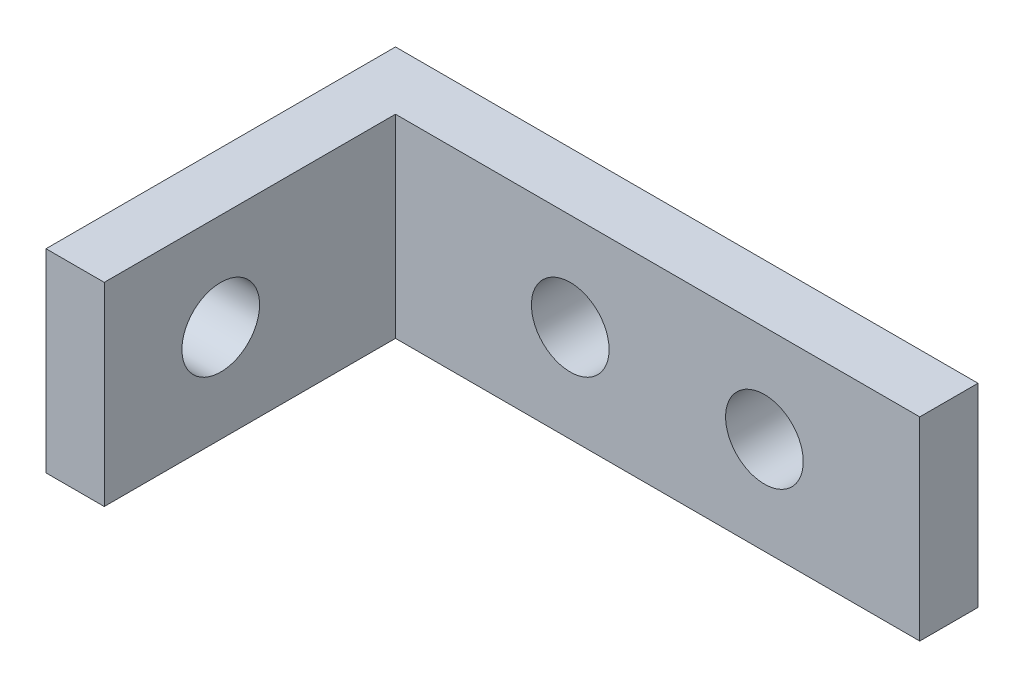
ISO-10303-21;
HEADER;
FILE_DESCRIPTION(('STEP AP214'),'2;1');
FILE_NAME('part.step','',(''),(''),'','','');
FILE_SCHEMA(('AUTOMOTIVE_DESIGN { 1 0 10303 214 1 1 1 1 }'));
ENDSEC;
DATA;
#1=APPLICATION_CONTEXT('core data for automotive mechanical design processes');
#2=APPLICATION_PROTOCOL_DEFINITION('international standard','automotive_design',2000,#1);
#3=PRODUCT_CONTEXT('',#1,'mechanical');
#4=PRODUCT('Part','Part','',(#3));
#5=PRODUCT_RELATED_PRODUCT_CATEGORY('part','',(#4));
#6=PRODUCT_DEFINITION_FORMATION('','',#4);
#7=PRODUCT_DEFINITION_CONTEXT('part definition',#1,'design');
#8=PRODUCT_DEFINITION('design','',#6,#7);
#9=PRODUCT_DEFINITION_SHAPE('','',#8);
#10=(LENGTH_UNIT() NAMED_UNIT(*) SI_UNIT(.MILLI.,.METRE.));
#11=(NAMED_UNIT(*) PLANE_ANGLE_UNIT() SI_UNIT($,.RADIAN.));
#12=(NAMED_UNIT(*) SI_UNIT($,.STERADIAN.) SOLID_ANGLE_UNIT());
#13=UNCERTAINTY_MEASURE_WITH_UNIT(LENGTH_MEASURE(1.E-05),#10,'distance_accuracy_value','');
#14=(GEOMETRIC_REPRESENTATION_CONTEXT(3) GLOBAL_UNCERTAINTY_ASSIGNED_CONTEXT((#13)) GLOBAL_UNIT_ASSIGNED_CONTEXT((#10,
#11,#12)) REPRESENTATION_CONTEXT('',''));
#15=CARTESIAN_POINT('',(0.,0.,0.));
#16=DIRECTION('',(0.,0.,1.));
#17=DIRECTION('',(1.,0.,0.));
#18=AXIS2_PLACEMENT_3D('',#15,#16,#17);
#19=CARTESIAN_POINT('',(0.,0.,3.));
#20=DIRECTION('',(0.,0.,-1.));
#21=DIRECTION('',(-1.,0.,0.));
#22=AXIS2_PLACEMENT_3D('',#19,#20,#21);
#23=PLANE('',#22);
#24=CARTESIAN_POINT('',(22.,5.,3.));
#25=DIRECTION('',(0.,0.,1.));
#26=DIRECTION('',(1.,0.,0.));
#27=AXIS2_PLACEMENT_3D('',#24,#25,#26);
#28=CIRCLE('',#27,2.);
#29=CARTESIAN_POINT('',(24.,5.,3.));
#30=VERTEX_POINT('',#29);
#31=EDGE_CURVE('E150',#30,#30,#28,.T.);
#32=ORIENTED_EDGE('',*,*,#31,.F.);
#33=EDGE_LOOP('',(#32));
#34=FACE_BOUND('',#33,.T.);
#35=CARTESIAN_POINT('',(12.,5.,3.));
#36=DIRECTION('',(0.,0.,1.));
#37=DIRECTION('',(1.,0.,0.));
#38=AXIS2_PLACEMENT_3D('',#35,#36,#37);
#39=CIRCLE('',#38,2.);
#40=CARTESIAN_POINT('',(14.,5.,3.));
#41=VERTEX_POINT('',#40);
#42=EDGE_CURVE('E100',#41,#41,#39,.T.);
#43=ORIENTED_EDGE('',*,*,#42,.F.);
#44=EDGE_LOOP('',(#43));
#45=FACE_BOUND('',#44,.T.);
#46=DIRECTION('',(0.,1.,0.));
#47=VECTOR('',#46,1.);
#48=CARTESIAN_POINT('',(3.,10.,3.));
#49=LINE('',#48,#47);
#50=CARTESIAN_POINT('',(3.,0.,3.));
#51=VERTEX_POINT('',#50);
#52=CARTESIAN_POINT('',(3.,10.,3.));
#53=VERTEX_POINT('',#52);
#54=EDGE_CURVE('E48',#51,#53,#49,.T.);
#55=ORIENTED_EDGE('',*,*,#54,.F.);
#56=DIRECTION('',(1.,0.,0.));
#57=VECTOR('',#56,1.);
#58=CARTESIAN_POINT('',(0.,0.,3.));
#59=LINE('',#58,#57);
#60=CARTESIAN_POINT('',(30.,0.,3.));
#61=VERTEX_POINT('',#60);
#62=EDGE_CURVE('E85',#51,#61,#59,.T.);
#63=ORIENTED_EDGE('',*,*,#62,.T.);
#64=DIRECTION('',(0.,1.,0.));
#65=VECTOR('',#64,1.);
#66=CARTESIAN_POINT('',(30.,0.,3.));
#67=LINE('',#66,#65);
#68=CARTESIAN_POINT('',(30.,10.,3.));
#69=VERTEX_POINT('',#68);
#70=EDGE_CURVE('E54',#61,#69,#67,.T.);
#71=ORIENTED_EDGE('',*,*,#70,.T.);
#72=DIRECTION('',(-1.,0.,0.));
#73=VECTOR('',#72,1.);
#74=CARTESIAN_POINT('',(0.,10.,3.));
#75=LINE('',#74,#73);
#76=EDGE_CURVE('E95',#69,#53,#75,.T.);
#77=ORIENTED_EDGE('',*,*,#76,.T.);
#78=EDGE_LOOP('',(#55,#63,#71,#77));
#79=FACE_BOUND('',#78,.T.);
#80=ADVANCED_FACE('F33',(#34,#45,#79),#23,.F.);
#81=CARTESIAN_POINT('',(0.,0.,0.));
#82=DIRECTION('',(0.,0.,-1.));
#83=DIRECTION('',(-1.,0.,0.));
#84=AXIS2_PLACEMENT_3D('',#81,#82,#83);
#85=PLANE('',#84);
#86=CARTESIAN_POINT('',(12.,5.,0.));
#87=DIRECTION('',(0.,0.,1.));
#88=DIRECTION('',(1.,0.,0.));
#89=AXIS2_PLACEMENT_3D('',#86,#87,#88);
#90=CIRCLE('',#89,2.);
#91=CARTESIAN_POINT('',(14.,5.,0.));
#92=VERTEX_POINT('',#91);
#93=EDGE_CURVE('E104',#92,#92,#90,.T.);
#94=ORIENTED_EDGE('',*,*,#93,.T.);
#95=EDGE_LOOP('',(#94));
#96=FACE_BOUND('',#95,.T.);
#97=DIRECTION('',(0.,-1.,0.));
#98=VECTOR('',#97,1.);
#99=CARTESIAN_POINT('',(0.,0.,0.));
#100=LINE('',#99,#98);
#101=CARTESIAN_POINT('',(0.,10.,0.));
#102=VERTEX_POINT('',#101);
#103=CARTESIAN_POINT('',(0.,0.,0.));
#104=VERTEX_POINT('',#103);
#105=EDGE_CURVE('E92',#102,#104,#100,.T.);
#106=ORIENTED_EDGE('',*,*,#105,.F.);
#107=DIRECTION('',(-1.,0.,0.));
#108=VECTOR('',#107,1.);
#109=CARTESIAN_POINT('',(0.,10.,0.));
#110=LINE('',#109,#108);
#111=CARTESIAN_POINT('',(30.,10.,0.));
#112=VERTEX_POINT('',#111);
#113=EDGE_CURVE('E74',#112,#102,#110,.T.);
#114=ORIENTED_EDGE('',*,*,#113,.F.);
#115=DIRECTION('',(0.,1.,0.));
#116=VECTOR('',#115,1.);
#117=CARTESIAN_POINT('',(30.,0.,0.));
#118=LINE('',#117,#116);
#119=CARTESIAN_POINT('',(30.,0.,0.));
#120=VERTEX_POINT('',#119);
#121=EDGE_CURVE('E86',#120,#112,#118,.T.);
#122=ORIENTED_EDGE('',*,*,#121,.F.);
#123=DIRECTION('',(1.,0.,0.));
#124=VECTOR('',#123,1.);
#125=CARTESIAN_POINT('',(0.,0.,0.));
#126=LINE('',#125,#124);
#127=EDGE_CURVE('E99',#104,#120,#126,.T.);
#128=ORIENTED_EDGE('',*,*,#127,.F.);
#129=EDGE_LOOP('',(#106,#114,#122,#128));
#130=FACE_BOUND('',#129,.T.);
#131=CARTESIAN_POINT('',(22.,5.,0.));
#132=DIRECTION('',(0.,0.,1.));
#133=DIRECTION('',(1.,0.,0.));
#134=AXIS2_PLACEMENT_3D('',#131,#132,#133);
#135=CIRCLE('',#134,2.);
#136=CARTESIAN_POINT('',(24.,5.,0.));
#137=VERTEX_POINT('',#136);
#138=EDGE_CURVE('E149',#137,#137,#135,.T.);
#139=ORIENTED_EDGE('',*,*,#138,.T.);
#140=EDGE_LOOP('',(#139));
#141=FACE_BOUND('',#140,.T.);
#142=ADVANCED_FACE('F97',(#96,#130,#141),#85,.T.);
#143=CARTESIAN_POINT('',(0.,0.,3.));
#144=DIRECTION('',(1.,0.,0.));
#145=DIRECTION('',(0.,0.,-1.));
#146=AXIS2_PLACEMENT_3D('',#143,#144,#145);
#147=PLANE('',#146);
#148=CARTESIAN_POINT('',(0.,5.,12.));
#149=DIRECTION('',(1.,0.,0.));
#150=DIRECTION('',(0.,0.,-1.));
#151=AXIS2_PLACEMENT_3D('',#148,#149,#150);
#152=CIRCLE('',#151,2.);
#153=CARTESIAN_POINT('',(0.,5.,10.));
#154=VERTEX_POINT('',#153);
#155=EDGE_CURVE('E146',#154,#154,#152,.T.);
#156=ORIENTED_EDGE('',*,*,#155,.T.);
#157=EDGE_LOOP('',(#156));
#158=FACE_BOUND('',#157,.T.);
#159=ORIENTED_EDGE('',*,*,#105,.T.);
#160=DIRECTION('',(0.,0.,-1.));
#161=VECTOR('',#160,1.);
#162=CARTESIAN_POINT('',(0.,0.,3.));
#163=LINE('',#162,#161);
#164=CARTESIAN_POINT('',(0.,0.,18.));
#165=VERTEX_POINT('',#164);
#166=EDGE_CURVE('E11',#165,#104,#163,.T.);
#167=ORIENTED_EDGE('',*,*,#166,.F.);
#168=DIRECTION('',(0.,-1.,0.));
#169=VECTOR('',#168,1.);
#170=CARTESIAN_POINT('',(0.,10.,18.));
#171=LINE('',#170,#169);
#172=CARTESIAN_POINT('',(0.,10.,18.));
#173=VERTEX_POINT('',#172);
#174=EDGE_CURVE('E94',#173,#165,#171,.T.);
#175=ORIENTED_EDGE('',*,*,#174,.F.);
#176=DIRECTION('',(0.,0.,-1.));
#177=VECTOR('',#176,1.);
#178=CARTESIAN_POINT('',(0.,10.,3.));
#179=LINE('',#178,#177);
#180=EDGE_CURVE('E78',#173,#102,#179,.T.);
#181=ORIENTED_EDGE('',*,*,#180,.T.);
#182=EDGE_LOOP('',(#159,#167,#175,#181));
#183=FACE_BOUND('',#182,.T.);
#184=ADVANCED_FACE('F35',(#158,#183),#147,.F.);
#185=CARTESIAN_POINT('',(0.,0.,3.));
#186=DIRECTION('',(0.,1.,0.));
#187=DIRECTION('',(0.,0.,1.));
#188=AXIS2_PLACEMENT_3D('',#185,#186,#187);
#189=PLANE('',#188);
#190=ORIENTED_EDGE('',*,*,#127,.T.);
#191=DIRECTION('',(0.,0.,-1.));
#192=VECTOR('',#191,1.);
#193=CARTESIAN_POINT('',(30.,0.,3.));
#194=LINE('',#193,#192);
#195=EDGE_CURVE('E41',#61,#120,#194,.T.);
#196=ORIENTED_EDGE('',*,*,#195,.F.);
#197=ORIENTED_EDGE('',*,*,#62,.F.);
#198=DIRECTION('',(0.,0.,-1.));
#199=VECTOR('',#198,1.);
#200=CARTESIAN_POINT('',(3.,0.,18.));
#201=LINE('',#200,#199);
#202=CARTESIAN_POINT('',(3.,0.,18.));
#203=VERTEX_POINT('',#202);
#204=EDGE_CURVE('E141',#203,#51,#201,.T.);
#205=ORIENTED_EDGE('',*,*,#204,.F.);
#206=DIRECTION('',(1.,0.,0.));
#207=VECTOR('',#206,1.);
#208=CARTESIAN_POINT('',(0.,0.,18.));
#209=LINE('',#208,#207);
#210=EDGE_CURVE('E121',#165,#203,#209,.T.);
#211=ORIENTED_EDGE('',*,*,#210,.F.);
#212=ORIENTED_EDGE('',*,*,#166,.T.);
#213=EDGE_LOOP('',(#190,#196,#197,#205,#211,#212));
#214=FACE_BOUND('',#213,.T.);
#215=ADVANCED_FACE('F115',(#214),#189,.F.);
#216=CARTESIAN_POINT('',(30.,0.,3.));
#217=DIRECTION('',(-1.,0.,0.));
#218=DIRECTION('',(0.,0.,1.));
#219=AXIS2_PLACEMENT_3D('',#216,#217,#218);
#220=PLANE('',#219);
#221=ORIENTED_EDGE('',*,*,#121,.T.);
#222=DIRECTION('',(0.,0.,-1.));
#223=VECTOR('',#222,1.);
#224=CARTESIAN_POINT('',(30.,10.,3.));
#225=LINE('',#224,#223);
#226=EDGE_CURVE('E81',#69,#112,#225,.T.);
#227=ORIENTED_EDGE('',*,*,#226,.F.);
#228=ORIENTED_EDGE('',*,*,#70,.F.);
#229=ORIENTED_EDGE('',*,*,#195,.T.);
#230=EDGE_LOOP('',(#221,#227,#228,#229));
#231=FACE_BOUND('',#230,.T.);
#232=ADVANCED_FACE('F113',(#231),#220,.F.);
#233=CARTESIAN_POINT('',(0.,10.,3.));
#234=DIRECTION('',(0.,-1.,0.));
#235=DIRECTION('',(0.,0.,-1.));
#236=AXIS2_PLACEMENT_3D('',#233,#234,#235);
#237=PLANE('',#236);
#238=ORIENTED_EDGE('',*,*,#113,.T.);
#239=ORIENTED_EDGE('',*,*,#180,.F.);
#240=DIRECTION('',(-1.,0.,0.));
#241=VECTOR('',#240,1.);
#242=CARTESIAN_POINT('',(0.,10.,18.));
#243=LINE('',#242,#241);
#244=CARTESIAN_POINT('',(3.,10.,18.));
#245=VERTEX_POINT('',#244);
#246=EDGE_CURVE('E135',#245,#173,#243,.T.);
#247=ORIENTED_EDGE('',*,*,#246,.F.);
#248=DIRECTION('',(0.,0.,-1.));
#249=VECTOR('',#248,1.);
#250=CARTESIAN_POINT('',(3.,10.,18.));
#251=LINE('',#250,#249);
#252=EDGE_CURVE('E139',#245,#53,#251,.T.);
#253=ORIENTED_EDGE('',*,*,#252,.T.);
#254=ORIENTED_EDGE('',*,*,#76,.F.);
#255=ORIENTED_EDGE('',*,*,#226,.T.);
#256=EDGE_LOOP('',(#238,#239,#247,#253,#254,#255));
#257=FACE_BOUND('',#256,.T.);
#258=ADVANCED_FACE('F76',(#257),#237,.F.);
#259=CARTESIAN_POINT('',(12.,5.,3.));
#260=DIRECTION('',(0.,0.,-1.));
#261=DIRECTION('',(-1.,0.,0.));
#262=AXIS2_PLACEMENT_3D('',#259,#260,#261);
#263=CYLINDRICAL_SURFACE('',#262,2.);
#264=ORIENTED_EDGE('',*,*,#42,.T.);
#265=EDGE_LOOP('',(#264));
#266=FACE_BOUND('',#265,.T.);
#267=ORIENTED_EDGE('',*,*,#93,.F.);
#268=EDGE_LOOP('',(#267));
#269=FACE_BOUND('',#268,.T.);
#270=ADVANCED_FACE('F168',(#266,#269),#263,.F.);
#271=CARTESIAN_POINT('',(22.,5.,3.));
#272=DIRECTION('',(0.,0.,-1.));
#273=DIRECTION('',(-1.,0.,0.));
#274=AXIS2_PLACEMENT_3D('',#271,#272,#273);
#275=CYLINDRICAL_SURFACE('',#274,2.);
#276=ORIENTED_EDGE('',*,*,#31,.T.);
#277=EDGE_LOOP('',(#276));
#278=FACE_BOUND('',#277,.T.);
#279=ORIENTED_EDGE('',*,*,#138,.F.);
#280=EDGE_LOOP('',(#279));
#281=FACE_BOUND('',#280,.T.);
#282=ADVANCED_FACE('F194',(#278,#281),#275,.F.);
#283=CARTESIAN_POINT('',(3.,10.,18.));
#284=DIRECTION('',(-1.,0.,0.));
#285=DIRECTION('',(0.,-1.,0.));
#286=AXIS2_PLACEMENT_3D('',#283,#284,#285);
#287=PLANE('',#286);
#288=CARTESIAN_POINT('',(3.,5.,12.));
#289=DIRECTION('',(1.,0.,0.));
#290=DIRECTION('',(0.,1.,0.));
#291=AXIS2_PLACEMENT_3D('',#288,#289,#290);
#292=CIRCLE('',#291,2.);
#293=CARTESIAN_POINT('',(3.,7.,12.));
#294=VERTEX_POINT('',#293);
#295=EDGE_CURVE('E184',#294,#294,#292,.T.);
#296=ORIENTED_EDGE('',*,*,#295,.F.);
#297=EDGE_LOOP('',(#296));
#298=FACE_BOUND('',#297,.T.);
#299=ORIENTED_EDGE('',*,*,#54,.T.);
#300=ORIENTED_EDGE('',*,*,#252,.F.);
#301=DIRECTION('',(0.,1.,0.));
#302=VECTOR('',#301,1.);
#303=CARTESIAN_POINT('',(3.,10.,18.));
#304=LINE('',#303,#302);
#305=EDGE_CURVE('E132',#203,#245,#304,.T.);
#306=ORIENTED_EDGE('',*,*,#305,.F.);
#307=ORIENTED_EDGE('',*,*,#204,.T.);
#308=EDGE_LOOP('',(#299,#300,#306,#307));
#309=FACE_BOUND('',#308,.T.);
#310=ADVANCED_FACE('F140',(#298,#309),#287,.F.);
#311=CARTESIAN_POINT('',(0.,0.,18.));
#312=DIRECTION('',(0.,0.,1.));
#313=DIRECTION('',(1.,0.,0.));
#314=AXIS2_PLACEMENT_3D('',#311,#312,#313);
#315=PLANE('',#314);
#316=ORIENTED_EDGE('',*,*,#174,.T.);
#317=ORIENTED_EDGE('',*,*,#210,.T.);
#318=ORIENTED_EDGE('',*,*,#305,.T.);
#319=ORIENTED_EDGE('',*,*,#246,.T.);
#320=EDGE_LOOP('',(#316,#317,#318,#319));
#321=FACE_BOUND('',#320,.T.);
#322=ADVANCED_FACE('F134',(#321),#315,.T.);
#323=CARTESIAN_POINT('',(-24.,5.,12.));
#324=DIRECTION('',(1.,0.,0.));
#325=DIRECTION('',(0.,1.,0.));
#326=AXIS2_PLACEMENT_3D('',#323,#324,#325);
#327=CYLINDRICAL_SURFACE('',#326,2.);
#328=ORIENTED_EDGE('',*,*,#295,.T.);
#329=EDGE_LOOP('',(#328));
#330=FACE_BOUND('',#329,.T.);
#331=ORIENTED_EDGE('',*,*,#155,.F.);
#332=EDGE_LOOP('',(#331));
#333=FACE_BOUND('',#332,.T.);
#334=ADVANCED_FACE('F191',(#330,#333),#327,.F.);
#335=CLOSED_SHELL('',(#80,#142,#184,#215,#232,#258,#270,#282,#310,#322,#334));
#336=MANIFOLD_SOLID_BREP('B2',#335);
#337=ADVANCED_BREP_SHAPE_REPRESENTATION('',(#18,#336),#14);
#338=SHAPE_DEFINITION_REPRESENTATION(#9,#337);
ENDSEC;
END-ISO-10303-21;
